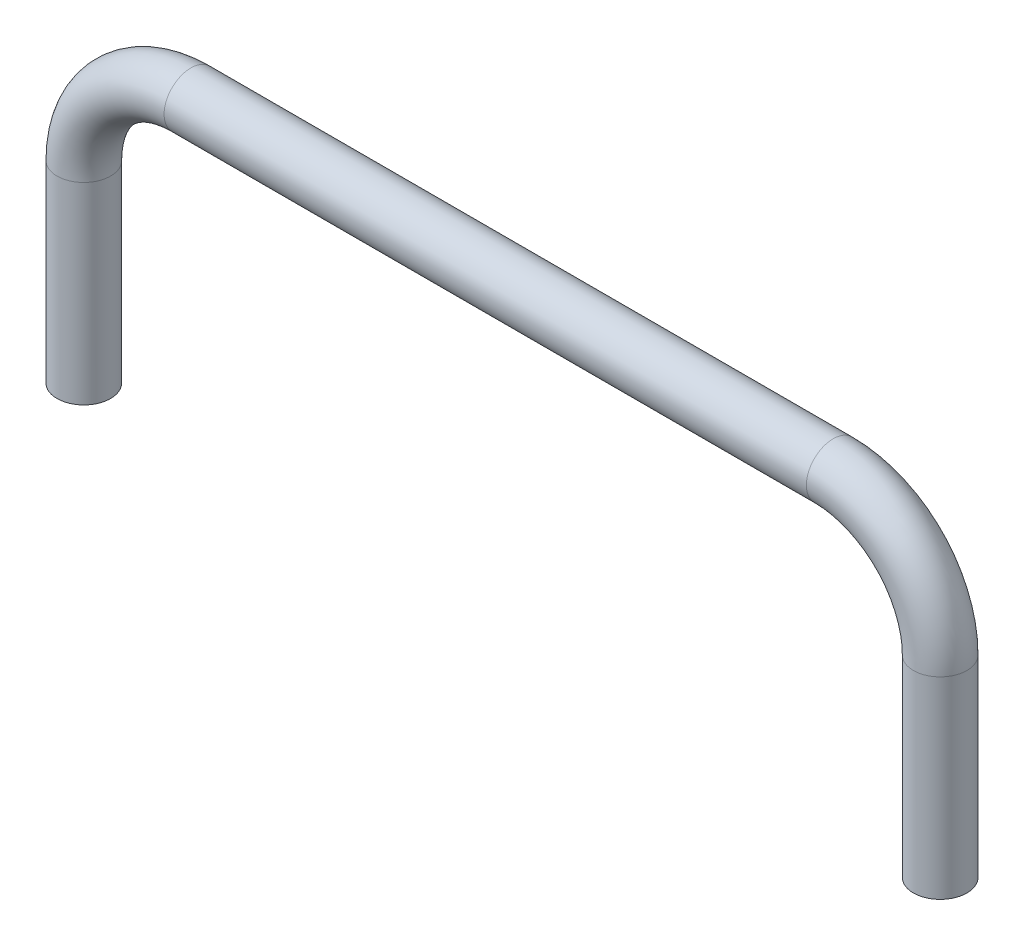
ISO-10303-21;
HEADER;
FILE_DESCRIPTION(('STEP AP214'),'2;1');
FILE_NAME('part.step','',(''),(''),'','','');
FILE_SCHEMA(('AUTOMOTIVE_DESIGN { 1 0 10303 214 1 1 1 1 }'));
ENDSEC;
DATA;
#1=APPLICATION_CONTEXT('core data for automotive mechanical design processes');
#2=APPLICATION_PROTOCOL_DEFINITION('international standard','automotive_design',2000,#1);
#3=PRODUCT_CONTEXT('',#1,'mechanical');
#4=PRODUCT('Part','Part','',(#3));
#5=PRODUCT_RELATED_PRODUCT_CATEGORY('part','',(#4));
#6=PRODUCT_DEFINITION_FORMATION('','',#4);
#7=PRODUCT_DEFINITION_CONTEXT('part definition',#1,'design');
#8=PRODUCT_DEFINITION('design','',#6,#7);
#9=PRODUCT_DEFINITION_SHAPE('','',#8);
#10=(LENGTH_UNIT() NAMED_UNIT(*) SI_UNIT(.MILLI.,.METRE.));
#11=(NAMED_UNIT(*) PLANE_ANGLE_UNIT() SI_UNIT($,.RADIAN.));
#12=(NAMED_UNIT(*) SI_UNIT($,.STERADIAN.) SOLID_ANGLE_UNIT());
#13=UNCERTAINTY_MEASURE_WITH_UNIT(LENGTH_MEASURE(1.E-05),#10,'distance_accuracy_value','');
#14=(GEOMETRIC_REPRESENTATION_CONTEXT(3) GLOBAL_UNCERTAINTY_ASSIGNED_CONTEXT((#13)) GLOBAL_UNIT_ASSIGNED_CONTEXT((#10,
#11,#12)) REPRESENTATION_CONTEXT('',''));
#15=CARTESIAN_POINT('',(0.,0.,0.));
#16=DIRECTION('',(0.,0.,1.));
#17=DIRECTION('',(1.,0.,0.));
#18=AXIS2_PLACEMENT_3D('',#15,#16,#17);
#19=CARTESIAN_POINT('',(50.8,22.8599999999999,0.));
#20=DIRECTION('',(0.,-1.,0.));
#21=DIRECTION('',(0.,0.,-1.));
#22=AXIS2_PLACEMENT_3D('',#19,#20,#21);
#23=CYLINDRICAL_SURFACE('',#22,3.175);
#24=CARTESIAN_POINT('',(50.8,22.8599999999999,0.));
#25=DIRECTION('',(0.,-1.,0.));
#26=DIRECTION('',(0.,0.,1.));
#27=AXIS2_PLACEMENT_3D('',#24,#25,#26);
#28=CIRCLE('',#27,3.175);
#29=CARTESIAN_POINT('',(53.975,22.8599999999999,0.));
#30=VERTEX_POINT('',#29);
#31=EDGE_CURVE('E34',#30,#30,#28,.T.);
#32=ORIENTED_EDGE('',*,*,#31,.T.);
#33=EDGE_LOOP('',(#32));
#34=FACE_BOUND('',#33,.T.);
#35=CARTESIAN_POINT('',(50.8,0.,0.));
#36=DIRECTION('',(0.,-1.,0.));
#37=DIRECTION('',(0.,0.,1.));
#38=AXIS2_PLACEMENT_3D('',#35,#36,#37);
#39=CIRCLE('',#38,3.175);
#40=CARTESIAN_POINT('',(50.8,0.,3.175));
#41=VERTEX_POINT('',#40);
#42=EDGE_CURVE('E10',#41,#41,#39,.T.);
#43=ORIENTED_EDGE('',*,*,#42,.F.);
#44=EDGE_LOOP('',(#43));
#45=FACE_BOUND('',#44,.T.);
#46=ADVANCED_FACE('F28',(#34,#45),#23,.T.);
#47=CARTESIAN_POINT('',(38.1,22.86,0.));
#48=DIRECTION('',(0.,0.,-1.));
#49=DIRECTION('',(-1.,0.,0.));
#50=AXIS2_PLACEMENT_3D('',#47,#48,#49);
#51=TOROIDAL_SURFACE('',#50,12.7,3.175);
#52=CARTESIAN_POINT('',(38.0999999999999,35.56,0.));
#53=DIRECTION('',(1.,0.,0.));
#54=DIRECTION('',(0.,0.,1.));
#55=AXIS2_PLACEMENT_3D('',#52,#53,#54);
#56=CIRCLE('',#55,3.175);
#57=CARTESIAN_POINT('',(38.0999999999999,38.735,0.));
#58=VERTEX_POINT('',#57);
#59=EDGE_CURVE('E38',#58,#58,#56,.T.);
#60=CARTESIAN_POINT('',(38.1,22.86,0.));
#61=DIRECTION('',(0.,0.,-1.));
#62=DIRECTION('',(-1.,0.,0.));
#63=AXIS2_PLACEMENT_3D('',#60,#61,#62);
#64=CIRCLE('',#63,15.875);
#65=EDGE_CURVE('',#58,#30,#64,.T.);
#66=ORIENTED_EDGE('',*,*,#59,.T.);
#67=ORIENTED_EDGE('',*,*,#31,.F.);
#68=ORIENTED_EDGE('',*,*,#65,.T.);
#69=ORIENTED_EDGE('',*,*,#65,.F.);
#70=EDGE_LOOP('',(#66,#68,#67,#69));
#71=FACE_BOUND('',#70,.T.);
#72=ADVANCED_FACE('F72',(#71),#51,.T.);
#73=CARTESIAN_POINT('',(-38.0999999999999,35.56,0.));
#74=DIRECTION('',(1.,0.,0.));
#75=DIRECTION('',(0.,0.,-1.));
#76=AXIS2_PLACEMENT_3D('',#73,#74,#75);
#77=CYLINDRICAL_SURFACE('',#76,3.175);
#78=CARTESIAN_POINT('',(-38.0999999999999,35.56,0.));
#79=DIRECTION('',(1.,0.,0.));
#80=DIRECTION('',(0.,0.,1.));
#81=AXIS2_PLACEMENT_3D('',#78,#79,#80);
#82=CIRCLE('',#81,3.175);
#83=CARTESIAN_POINT('',(-38.0999999999999,38.735,0.));
#84=VERTEX_POINT('',#83);
#85=EDGE_CURVE('E42',#84,#84,#82,.T.);
#86=ORIENTED_EDGE('',*,*,#85,.T.);
#87=EDGE_LOOP('',(#86));
#88=FACE_BOUND('',#87,.T.);
#89=ORIENTED_EDGE('',*,*,#59,.F.);
#90=EDGE_LOOP('',(#89));
#91=FACE_BOUND('',#90,.T.);
#92=ADVANCED_FACE('F76',(#88,#91),#77,.T.);
#93=CARTESIAN_POINT('',(-38.1,22.86,0.));
#94=DIRECTION('',(0.,0.,-1.));
#95=DIRECTION('',(-1.,0.,0.));
#96=AXIS2_PLACEMENT_3D('',#93,#94,#95);
#97=TOROIDAL_SURFACE('',#96,12.7,3.175);
#98=CARTESIAN_POINT('',(-50.8,22.8599999999999,0.));
#99=DIRECTION('',(0.,1.,0.));
#100=DIRECTION('',(0.,0.,1.));
#101=AXIS2_PLACEMENT_3D('',#98,#99,#100);
#102=CIRCLE('',#101,3.175);
#103=CARTESIAN_POINT('',(-53.975,22.8599999999999,0.));
#104=VERTEX_POINT('',#103);
#105=EDGE_CURVE('E47',#104,#104,#102,.T.);
#106=CARTESIAN_POINT('',(-38.1,22.86,0.));
#107=DIRECTION('',(0.,0.,-1.));
#108=DIRECTION('',(-1.,0.,0.));
#109=AXIS2_PLACEMENT_3D('',#106,#107,#108);
#110=CIRCLE('',#109,15.875);
#111=EDGE_CURVE('',#104,#84,#110,.T.);
#112=ORIENTED_EDGE('',*,*,#105,.T.);
#113=ORIENTED_EDGE('',*,*,#85,.F.);
#114=ORIENTED_EDGE('',*,*,#111,.T.);
#115=ORIENTED_EDGE('',*,*,#111,.F.);
#116=EDGE_LOOP('',(#112,#114,#113,#115));
#117=FACE_BOUND('',#116,.T.);
#118=ADVANCED_FACE('F54',(#117),#97,.T.);
#119=CARTESIAN_POINT('',(-50.8,22.8599999999999,0.));
#120=DIRECTION('',(0.,-1.,0.));
#121=DIRECTION('',(0.,0.,-1.));
#122=AXIS2_PLACEMENT_3D('',#119,#120,#121);
#123=CYLINDRICAL_SURFACE('',#122,3.175);
#124=ORIENTED_EDGE('',*,*,#105,.F.);
#125=EDGE_LOOP('',(#124));
#126=FACE_BOUND('',#125,.T.);
#127=CARTESIAN_POINT('',(-50.8,0.,0.));
#128=DIRECTION('',(0.,1.,0.));
#129=DIRECTION('',(0.,0.,1.));
#130=AXIS2_PLACEMENT_3D('',#127,#128,#129);
#131=CIRCLE('',#130,3.175);
#132=CARTESIAN_POINT('',(-50.8,0.,3.175));
#133=VERTEX_POINT('',#132);
#134=EDGE_CURVE('E48',#133,#133,#131,.T.);
#135=ORIENTED_EDGE('',*,*,#134,.T.);
#136=EDGE_LOOP('',(#135));
#137=FACE_BOUND('',#136,.T.);
#138=ADVANCED_FACE('F57',(#126,#137),#123,.T.);
#139=CARTESIAN_POINT('',(50.8,0.,0.));
#140=DIRECTION('',(0.,-1.,0.));
#141=DIRECTION('',(0.,0.,1.));
#142=AXIS2_PLACEMENT_3D('',#139,#140,#141);
#143=PLANE('',#142);
#144=ORIENTED_EDGE('',*,*,#42,.T.);
#145=EDGE_LOOP('',(#144));
#146=FACE_BOUND('',#145,.T.);
#147=ADVANCED_FACE('F60',(#146),#143,.T.);
#148=CARTESIAN_POINT('',(-50.8,0.,0.));
#149=DIRECTION('',(0.,1.,0.));
#150=DIRECTION('',(0.,0.,1.));
#151=AXIS2_PLACEMENT_3D('',#148,#149,#150);
#152=PLANE('',#151);
#153=ORIENTED_EDGE('',*,*,#134,.F.);
#154=EDGE_LOOP('',(#153));
#155=FACE_BOUND('',#154,.T.);
#156=ADVANCED_FACE('F64',(#155),#152,.F.);
#157=CLOSED_SHELL('',(#46,#72,#92,#118,#138,#147,#156));
#158=MANIFOLD_SOLID_BREP('B2',#157);
#159=ADVANCED_BREP_SHAPE_REPRESENTATION('',(#18,#158),#14);
#160=SHAPE_DEFINITION_REPRESENTATION(#9,#159);
ENDSEC;
END-ISO-10303-21;
